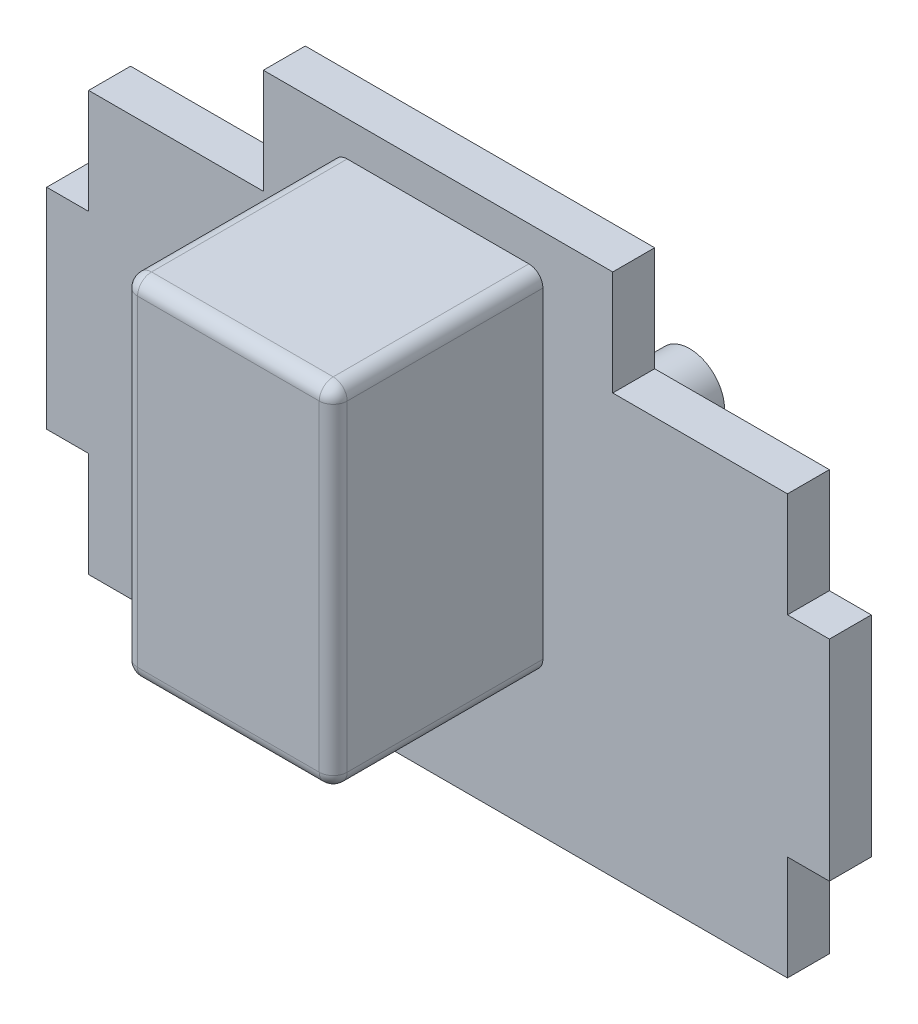
ISO-10303-21;
HEADER;
FILE_DESCRIPTION(('STEP AP214'),'2;1');
FILE_NAME('part.step','',(''),(''),'','','');
FILE_SCHEMA(('AUTOMOTIVE_DESIGN { 1 0 10303 214 1 1 1 1 }'));
ENDSEC;
DATA;
#1=APPLICATION_CONTEXT('core data for automotive mechanical design processes');
#2=APPLICATION_PROTOCOL_DEFINITION('international standard','automotive_design',2000,#1);
#3=PRODUCT_CONTEXT('',#1,'mechanical');
#4=PRODUCT('Part','Part','',(#3));
#5=PRODUCT_RELATED_PRODUCT_CATEGORY('part','',(#4));
#6=PRODUCT_DEFINITION_FORMATION('','',#4);
#7=PRODUCT_DEFINITION_CONTEXT('part definition',#1,'design');
#8=PRODUCT_DEFINITION('design','',#6,#7);
#9=PRODUCT_DEFINITION_SHAPE('','',#8);
#10=(LENGTH_UNIT() NAMED_UNIT(*) SI_UNIT(.MILLI.,.METRE.));
#11=(NAMED_UNIT(*) PLANE_ANGLE_UNIT() SI_UNIT($,.RADIAN.));
#12=(NAMED_UNIT(*) SI_UNIT($,.STERADIAN.) SOLID_ANGLE_UNIT());
#13=UNCERTAINTY_MEASURE_WITH_UNIT(LENGTH_MEASURE(1.E-05),#10,'distance_accuracy_value','');
#14=(GEOMETRIC_REPRESENTATION_CONTEXT(3) GLOBAL_UNCERTAINTY_ASSIGNED_CONTEXT((#13)) GLOBAL_UNIT_ASSIGNED_CONTEXT((#10,
#11,#12)) REPRESENTATION_CONTEXT('',''));
#15=CARTESIAN_POINT('',(0.,0.,0.));
#16=DIRECTION('',(0.,0.,1.));
#17=DIRECTION('',(1.,0.,0.));
#18=AXIS2_PLACEMENT_3D('',#15,#16,#17);
#19=CARTESIAN_POINT('',(0.,0.,0.));
#20=DIRECTION('',(0.,0.,1.));
#21=DIRECTION('',(1.,0.,0.));
#22=AXIS2_PLACEMENT_3D('',#19,#20,#21);
#23=PLANE('',#22);
#24=DIRECTION('',(0.,-1.,0.));
#25=VECTOR('',#24,1.);
#26=CARTESIAN_POINT('',(-1.25,0.,0.));
#27=LINE('',#26,#25);
#28=CARTESIAN_POINT('',(-1.25,-0.5,0.));
#29=VERTEX_POINT('',#28);
#30=CARTESIAN_POINT('',(-1.25,-1.25,0.));
#31=VERTEX_POINT('',#30);
#32=EDGE_CURVE('E220',#29,#31,#27,.T.);
#33=ORIENTED_EDGE('',*,*,#32,.F.);
#34=DIRECTION('',(-1.,0.,0.));
#35=VECTOR('',#34,1.);
#36=CARTESIAN_POINT('',(1.25,-0.5,0.));
#37=LINE('',#36,#35);
#38=CARTESIAN_POINT('',(1.25,-0.5,0.));
#39=VERTEX_POINT('',#38);
#40=EDGE_CURVE('E49',#39,#29,#37,.T.);
#41=ORIENTED_EDGE('',*,*,#40,.F.);
#42=DIRECTION('',(0.,1.,0.));
#43=VECTOR('',#42,1.);
#44=CARTESIAN_POINT('',(1.25,0.,0.));
#45=LINE('',#44,#43);
#46=CARTESIAN_POINT('',(1.25,-1.25,0.));
#47=VERTEX_POINT('',#46);
#48=EDGE_CURVE('E218',#47,#39,#45,.T.);
#49=ORIENTED_EDGE('',*,*,#48,.F.);
#50=DIRECTION('',(-1.,0.,0.));
#51=VECTOR('',#50,1.);
#52=CARTESIAN_POINT('',(1.25,-1.25,0.));
#53=LINE('',#52,#51);
#54=CARTESIAN_POINT('',(2.5,-1.25,0.));
#55=VERTEX_POINT('',#54);
#56=EDGE_CURVE('E260',#55,#47,#53,.T.);
#57=ORIENTED_EDGE('',*,*,#56,.F.);
#58=DIRECTION('',(0.,1.,0.));
#59=VECTOR('',#58,1.);
#60=CARTESIAN_POINT('',(2.5,-1.25,0.));
#61=LINE('',#60,#59);
#62=CARTESIAN_POINT('',(2.5,-2.,0.));
#63=VERTEX_POINT('',#62);
#64=EDGE_CURVE('E258',#63,#55,#61,.T.);
#65=ORIENTED_EDGE('',*,*,#64,.F.);
#66=DIRECTION('',(-1.,0.,0.));
#67=VECTOR('',#66,1.);
#68=CARTESIAN_POINT('',(2.5,-2.,0.));
#69=LINE('',#68,#67);
#70=CARTESIAN_POINT('',(2.8,-2.,0.));
#71=VERTEX_POINT('',#70);
#72=EDGE_CURVE('E256',#71,#63,#69,.T.);
#73=ORIENTED_EDGE('',*,*,#72,.F.);
#74=DIRECTION('',(0.,1.,0.));
#75=VECTOR('',#74,1.);
#76=CARTESIAN_POINT('',(2.8,-2.,0.));
#77=LINE('',#76,#75);
#78=CARTESIAN_POINT('',(2.8,-3.5,0.));
#79=VERTEX_POINT('',#78);
#80=EDGE_CURVE('E254',#79,#71,#77,.T.);
#81=ORIENTED_EDGE('',*,*,#80,.F.);
#82=DIRECTION('',(1.,0.,0.));
#83=VECTOR('',#82,1.);
#84=CARTESIAN_POINT('',(2.8,-3.5,0.));
#85=LINE('',#84,#83);
#86=CARTESIAN_POINT('',(2.5,-3.5,0.));
#87=VERTEX_POINT('',#86);
#88=EDGE_CURVE('E252',#87,#79,#85,.T.);
#89=ORIENTED_EDGE('',*,*,#88,.F.);
#90=DIRECTION('',(0.,1.,0.));
#91=VECTOR('',#90,1.);
#92=CARTESIAN_POINT('',(2.5,-3.5,0.));
#93=LINE('',#92,#91);
#94=CARTESIAN_POINT('',(2.5,-4.25,0.));
#95=VERTEX_POINT('',#94);
#96=EDGE_CURVE('E250',#95,#87,#93,.T.);
#97=ORIENTED_EDGE('',*,*,#96,.F.);
#98=DIRECTION('',(1.,0.,0.));
#99=VECTOR('',#98,1.);
#100=CARTESIAN_POINT('',(2.5,-4.25,0.));
#101=LINE('',#100,#99);
#102=CARTESIAN_POINT('',(-2.5,-4.25,0.));
#103=VERTEX_POINT('',#102);
#104=EDGE_CURVE('E248',#103,#95,#101,.T.);
#105=ORIENTED_EDGE('',*,*,#104,.F.);
#106=DIRECTION('',(0.,-1.,0.));
#107=VECTOR('',#106,1.);
#108=CARTESIAN_POINT('',(-2.5,-3.5,0.));
#109=LINE('',#108,#107);
#110=CARTESIAN_POINT('',(-2.5,-3.5,0.));
#111=VERTEX_POINT('',#110);
#112=EDGE_CURVE('E246',#111,#103,#109,.T.);
#113=ORIENTED_EDGE('',*,*,#112,.F.);
#114=DIRECTION('',(1.,0.,0.));
#115=VECTOR('',#114,1.);
#116=CARTESIAN_POINT('',(-2.8,-3.5,0.));
#117=LINE('',#116,#115);
#118=CARTESIAN_POINT('',(-2.8,-3.5,0.));
#119=VERTEX_POINT('',#118);
#120=EDGE_CURVE('E244',#119,#111,#117,.T.);
#121=ORIENTED_EDGE('',*,*,#120,.F.);
#122=DIRECTION('',(0.,-1.,0.));
#123=VECTOR('',#122,1.);
#124=CARTESIAN_POINT('',(-2.8,-2.,0.));
#125=LINE('',#124,#123);
#126=CARTESIAN_POINT('',(-2.8,-2.,0.));
#127=VERTEX_POINT('',#126);
#128=EDGE_CURVE('E242',#127,#119,#125,.T.);
#129=ORIENTED_EDGE('',*,*,#128,.F.);
#130=DIRECTION('',(-1.,0.,0.));
#131=VECTOR('',#130,1.);
#132=CARTESIAN_POINT('',(-2.5,-2.,0.));
#133=LINE('',#132,#131);
#134=CARTESIAN_POINT('',(-2.5,-2.,0.));
#135=VERTEX_POINT('',#134);
#136=EDGE_CURVE('E240',#135,#127,#133,.T.);
#137=ORIENTED_EDGE('',*,*,#136,.F.);
#138=DIRECTION('',(0.,-1.,0.));
#139=VECTOR('',#138,1.);
#140=CARTESIAN_POINT('',(-2.5,-1.25,0.));
#141=LINE('',#140,#139);
#142=CARTESIAN_POINT('',(-2.5,-1.25,0.));
#143=VERTEX_POINT('',#142);
#144=EDGE_CURVE('E238',#143,#135,#141,.T.);
#145=ORIENTED_EDGE('',*,*,#144,.F.);
#146=DIRECTION('',(-1.,0.,0.));
#147=VECTOR('',#146,1.);
#148=CARTESIAN_POINT('',(-1.25,-1.25,0.));
#149=LINE('',#148,#147);
#150=EDGE_CURVE('E228',#31,#143,#149,.T.);
#151=ORIENTED_EDGE('',*,*,#150,.F.);
#152=EDGE_LOOP('',(#33,#41,#49,#57,#65,#73,#81,#89,#97,#105,#113,#121,#129,#137,#145,#151));
#153=FACE_BOUND('',#152,.T.);
#154=CARTESIAN_POINT('',(0.,-2.75,0.));
#155=DIRECTION('',(0.,0.,1.));
#156=DIRECTION('',(1.,0.,0.));
#157=AXIS2_PLACEMENT_3D('',#154,#155,#156);
#158=CIRCLE('',#157,0.25);
#159=CARTESIAN_POINT('',(0.25,-2.75,0.));
#160=VERTEX_POINT('',#159);
#161=EDGE_CURVE('E42',#160,#160,#158,.F.);
#162=ORIENTED_EDGE('',*,*,#161,.F.);
#163=EDGE_LOOP('',(#162));
#164=FACE_BOUND('',#163,.T.);
#165=ADVANCED_FACE('F34',(#153,#164),#23,.F.);
#166=CARTESIAN_POINT('',(0.,0.,0.3));
#167=DIRECTION('',(0.,0.,1.));
#168=DIRECTION('',(1.,0.,0.));
#169=AXIS2_PLACEMENT_3D('',#166,#167,#168);
#170=PLANE('',#169);
#171=DIRECTION('',(1.,0.,0.));
#172=VECTOR('',#171,1.);
#173=CARTESIAN_POINT('',(0.,-0.5,0.3));
#174=LINE('',#173,#172);
#175=CARTESIAN_POINT('',(-1.25,-0.5,0.3));
#176=VERTEX_POINT('',#175);
#177=CARTESIAN_POINT('',(1.25,-0.5,0.3));
#178=VERTEX_POINT('',#177);
#179=EDGE_CURVE('E207',#176,#178,#174,.T.);
#180=ORIENTED_EDGE('',*,*,#179,.F.);
#181=DIRECTION('',(0.,-1.,0.));
#182=VECTOR('',#181,1.);
#183=CARTESIAN_POINT('',(-1.25,0.,0.3));
#184=LINE('',#183,#182);
#185=CARTESIAN_POINT('',(-1.25,-1.25,0.3));
#186=VERTEX_POINT('',#185);
#187=EDGE_CURVE('E541',#176,#186,#184,.T.);
#188=ORIENTED_EDGE('',*,*,#187,.T.);
#189=DIRECTION('',(-1.,0.,0.));
#190=VECTOR('',#189,1.);
#191=CARTESIAN_POINT('',(-1.25,-1.25,0.3));
#192=LINE('',#191,#190);
#193=CARTESIAN_POINT('',(-2.5,-1.25,0.3));
#194=VERTEX_POINT('',#193);
#195=EDGE_CURVE('E543',#186,#194,#192,.T.);
#196=ORIENTED_EDGE('',*,*,#195,.T.);
#197=DIRECTION('',(0.,-1.,0.));
#198=VECTOR('',#197,1.);
#199=CARTESIAN_POINT('',(-2.5,-1.25,0.3));
#200=LINE('',#199,#198);
#201=CARTESIAN_POINT('',(-2.5,-2.,0.3));
#202=VERTEX_POINT('',#201);
#203=EDGE_CURVE('E545',#194,#202,#200,.T.);
#204=ORIENTED_EDGE('',*,*,#203,.T.);
#205=DIRECTION('',(-1.,0.,0.));
#206=VECTOR('',#205,1.);
#207=CARTESIAN_POINT('',(-2.5,-2.,0.3));
#208=LINE('',#207,#206);
#209=CARTESIAN_POINT('',(-2.8,-2.,0.3));
#210=VERTEX_POINT('',#209);
#211=EDGE_CURVE('E547',#202,#210,#208,.T.);
#212=ORIENTED_EDGE('',*,*,#211,.T.);
#213=DIRECTION('',(0.,-1.,0.));
#214=VECTOR('',#213,1.);
#215=CARTESIAN_POINT('',(-2.8,-2.,0.3));
#216=LINE('',#215,#214);
#217=CARTESIAN_POINT('',(-2.8,-3.5,0.3));
#218=VERTEX_POINT('',#217);
#219=EDGE_CURVE('E549',#210,#218,#216,.T.);
#220=ORIENTED_EDGE('',*,*,#219,.T.);
#221=DIRECTION('',(1.,0.,0.));
#222=VECTOR('',#221,1.);
#223=CARTESIAN_POINT('',(-2.8,-3.5,0.3));
#224=LINE('',#223,#222);
#225=CARTESIAN_POINT('',(-2.5,-3.5,0.3));
#226=VERTEX_POINT('',#225);
#227=EDGE_CURVE('E551',#218,#226,#224,.T.);
#228=ORIENTED_EDGE('',*,*,#227,.T.);
#229=DIRECTION('',(0.,-1.,0.));
#230=VECTOR('',#229,1.);
#231=CARTESIAN_POINT('',(-2.5,-3.5,0.3));
#232=LINE('',#231,#230);
#233=CARTESIAN_POINT('',(-2.5,-4.25,0.3));
#234=VERTEX_POINT('',#233);
#235=EDGE_CURVE('E553',#226,#234,#232,.T.);
#236=ORIENTED_EDGE('',*,*,#235,.T.);
#237=DIRECTION('',(1.,0.,0.));
#238=VECTOR('',#237,1.);
#239=CARTESIAN_POINT('',(2.5,-4.25,0.3));
#240=LINE('',#239,#238);
#241=CARTESIAN_POINT('',(2.5,-4.25,0.3));
#242=VERTEX_POINT('',#241);
#243=EDGE_CURVE('E555',#234,#242,#240,.T.);
#244=ORIENTED_EDGE('',*,*,#243,.T.);
#245=DIRECTION('',(0.,1.,0.));
#246=VECTOR('',#245,1.);
#247=CARTESIAN_POINT('',(2.5,-3.5,0.3));
#248=LINE('',#247,#246);
#249=CARTESIAN_POINT('',(2.5,-3.5,0.3));
#250=VERTEX_POINT('',#249);
#251=EDGE_CURVE('E557',#242,#250,#248,.T.);
#252=ORIENTED_EDGE('',*,*,#251,.T.);
#253=DIRECTION('',(1.,0.,0.));
#254=VECTOR('',#253,1.);
#255=CARTESIAN_POINT('',(2.8,-3.5,0.3));
#256=LINE('',#255,#254);
#257=CARTESIAN_POINT('',(2.8,-3.5,0.3));
#258=VERTEX_POINT('',#257);
#259=EDGE_CURVE('E559',#250,#258,#256,.T.);
#260=ORIENTED_EDGE('',*,*,#259,.T.);
#261=DIRECTION('',(0.,1.,0.));
#262=VECTOR('',#261,1.);
#263=CARTESIAN_POINT('',(2.8,-2.,0.3));
#264=LINE('',#263,#262);
#265=CARTESIAN_POINT('',(2.8,-2.,0.3));
#266=VERTEX_POINT('',#265);
#267=EDGE_CURVE('E561',#258,#266,#264,.T.);
#268=ORIENTED_EDGE('',*,*,#267,.T.);
#269=DIRECTION('',(-1.,0.,0.));
#270=VECTOR('',#269,1.);
#271=CARTESIAN_POINT('',(2.5,-2.,0.3));
#272=LINE('',#271,#270);
#273=CARTESIAN_POINT('',(2.5,-2.,0.3));
#274=VERTEX_POINT('',#273);
#275=EDGE_CURVE('E563',#266,#274,#272,.T.);
#276=ORIENTED_EDGE('',*,*,#275,.T.);
#277=DIRECTION('',(0.,1.,0.));
#278=VECTOR('',#277,1.);
#279=CARTESIAN_POINT('',(2.5,-1.25,0.3));
#280=LINE('',#279,#278);
#281=CARTESIAN_POINT('',(2.5,-1.25,0.3));
#282=VERTEX_POINT('',#281);
#283=EDGE_CURVE('E564',#274,#282,#280,.T.);
#284=ORIENTED_EDGE('',*,*,#283,.T.);
#285=DIRECTION('',(-1.,0.,0.));
#286=VECTOR('',#285,1.);
#287=CARTESIAN_POINT('',(1.25,-1.25,0.3));
#288=LINE('',#287,#286);
#289=CARTESIAN_POINT('',(1.25,-1.25,0.3));
#290=VERTEX_POINT('',#289);
#291=EDGE_CURVE('E234',#282,#290,#288,.T.);
#292=ORIENTED_EDGE('',*,*,#291,.T.);
#293=DIRECTION('',(0.,1.,0.));
#294=VECTOR('',#293,1.);
#295=CARTESIAN_POINT('',(1.25,0.,0.3));
#296=LINE('',#295,#294);
#297=EDGE_CURVE('E262',#290,#178,#296,.T.);
#298=ORIENTED_EDGE('',*,*,#297,.T.);
#299=EDGE_LOOP('',(#180,#188,#196,#204,#212,#220,#228,#236,#244,#252,#260,#268,#276,#284,#292,#298));
#300=FACE_BOUND('',#299,.T.);
#301=DIRECTION('',(0.,1.,0.));
#302=VECTOR('',#301,1.);
#303=CARTESIAN_POINT('',(0.75,0.,0.3));
#304=LINE('',#303,#302);
#305=CARTESIAN_POINT('',(0.75,-3.15,0.3));
#306=VERTEX_POINT('',#305);
#307=CARTESIAN_POINT('',(0.75,-0.85,0.3));
#308=VERTEX_POINT('',#307);
#309=EDGE_CURVE('E534',#306,#308,#304,.T.);
#310=ORIENTED_EDGE('',*,*,#309,.F.);
#311=CARTESIAN_POINT('',(0.65,-3.15,0.3));
#312=DIRECTION('',(0.,0.,1.));
#313=DIRECTION('',(1.,0.,0.));
#314=AXIS2_PLACEMENT_3D('',#311,#312,#313);
#315=CIRCLE('',#314,0.1);
#316=CARTESIAN_POINT('',(0.65,-3.25,0.3));
#317=VERTEX_POINT('',#316);
#318=EDGE_CURVE('E340',#306,#317,#315,.F.);
#319=ORIENTED_EDGE('',*,*,#318,.T.);
#320=DIRECTION('',(1.,0.,0.));
#321=VECTOR('',#320,1.);
#322=CARTESIAN_POINT('',(0.,-3.25,0.3));
#323=LINE('',#322,#321);
#324=CARTESIAN_POINT('',(-0.65,-3.25,0.3));
#325=VERTEX_POINT('',#324);
#326=EDGE_CURVE('E379',#325,#317,#323,.T.);
#327=ORIENTED_EDGE('',*,*,#326,.F.);
#328=CARTESIAN_POINT('',(-0.65,-3.15,0.3));
#329=DIRECTION('',(0.,0.,1.));
#330=DIRECTION('',(1.,0.,0.));
#331=AXIS2_PLACEMENT_3D('',#328,#329,#330);
#332=CIRCLE('',#331,0.1);
#333=CARTESIAN_POINT('',(-0.75,-3.15,0.3));
#334=VERTEX_POINT('',#333);
#335=EDGE_CURVE('E338',#325,#334,#332,.F.);
#336=ORIENTED_EDGE('',*,*,#335,.T.);
#337=DIRECTION('',(0.,-1.,0.));
#338=VECTOR('',#337,1.);
#339=CARTESIAN_POINT('',(-0.75,0.,0.3));
#340=LINE('',#339,#338);
#341=CARTESIAN_POINT('',(-0.75,-0.85,0.3));
#342=VERTEX_POINT('',#341);
#343=EDGE_CURVE('E226',#342,#334,#340,.T.);
#344=ORIENTED_EDGE('',*,*,#343,.F.);
#345=CARTESIAN_POINT('',(-0.65,-0.85,0.3));
#346=DIRECTION('',(0.,0.,1.));
#347=DIRECTION('',(1.,0.,0.));
#348=AXIS2_PLACEMENT_3D('',#345,#346,#347);
#349=CIRCLE('',#348,0.1);
#350=CARTESIAN_POINT('',(-0.65,-0.75,0.3));
#351=VERTEX_POINT('',#350);
#352=EDGE_CURVE('E336',#342,#351,#349,.F.);
#353=ORIENTED_EDGE('',*,*,#352,.T.);
#354=DIRECTION('',(1.,0.,0.));
#355=VECTOR('',#354,1.);
#356=CARTESIAN_POINT('',(0.,-0.75,0.3));
#357=LINE('',#356,#355);
#358=CARTESIAN_POINT('',(0.65,-0.75,0.3));
#359=VERTEX_POINT('',#358);
#360=EDGE_CURVE('E231',#351,#359,#357,.T.);
#361=ORIENTED_EDGE('',*,*,#360,.T.);
#362=CARTESIAN_POINT('',(0.65,-0.85,0.3));
#363=DIRECTION('',(0.,0.,1.));
#364=DIRECTION('',(1.,0.,0.));
#365=AXIS2_PLACEMENT_3D('',#362,#363,#364);
#366=CIRCLE('',#365,0.1);
#367=EDGE_CURVE('E342',#359,#308,#366,.F.);
#368=ORIENTED_EDGE('',*,*,#367,.T.);
#369=EDGE_LOOP('',(#310,#319,#327,#336,#344,#353,#361,#368));
#370=FACE_BOUND('',#369,.T.);
#371=ADVANCED_FACE('F385',(#300,#370),#170,.T.);
#372=CARTESIAN_POINT('',(1.25,0.,0.3));
#373=DIRECTION('',(-1.,0.,0.));
#374=DIRECTION('',(0.,0.,1.));
#375=AXIS2_PLACEMENT_3D('',#372,#373,#374);
#376=PLANE('',#375);
#377=ORIENTED_EDGE('',*,*,#48,.T.);
#378=DIRECTION('',(0.,0.,-1.));
#379=VECTOR('',#378,1.);
#380=CARTESIAN_POINT('',(1.25,-0.5,10.));
#381=LINE('',#380,#379);
#382=EDGE_CURVE('E204',#178,#39,#381,.T.);
#383=ORIENTED_EDGE('',*,*,#382,.F.);
#384=ORIENTED_EDGE('',*,*,#297,.F.);
#385=DIRECTION('',(0.,0.,-1.));
#386=VECTOR('',#385,1.);
#387=CARTESIAN_POINT('',(1.25,-1.25,0.3));
#388=LINE('',#387,#386);
#389=EDGE_CURVE('E225',#290,#47,#388,.T.);
#390=ORIENTED_EDGE('',*,*,#389,.T.);
#391=EDGE_LOOP('',(#377,#383,#384,#390));
#392=FACE_BOUND('',#391,.T.);
#393=ADVANCED_FACE('F223',(#392),#376,.F.);
#394=CARTESIAN_POINT('',(-1.25,0.,0.3));
#395=DIRECTION('',(1.,0.,0.));
#396=DIRECTION('',(0.,0.,-1.));
#397=AXIS2_PLACEMENT_3D('',#394,#395,#396);
#398=PLANE('',#397);
#399=ORIENTED_EDGE('',*,*,#187,.F.);
#400=DIRECTION('',(0.,0.,-1.));
#401=VECTOR('',#400,1.);
#402=CARTESIAN_POINT('',(-1.25,-0.5,0.3));
#403=LINE('',#402,#401);
#404=EDGE_CURVE('E11',#176,#29,#403,.T.);
#405=ORIENTED_EDGE('',*,*,#404,.T.);
#406=ORIENTED_EDGE('',*,*,#32,.T.);
#407=DIRECTION('',(0.,0.,-1.));
#408=VECTOR('',#407,1.);
#409=CARTESIAN_POINT('',(-1.25,-1.25,0.3));
#410=LINE('',#409,#408);
#411=EDGE_CURVE('E300',#186,#31,#410,.T.);
#412=ORIENTED_EDGE('',*,*,#411,.F.);
#413=EDGE_LOOP('',(#399,#405,#406,#412));
#414=FACE_BOUND('',#413,.T.);
#415=ADVANCED_FACE('F447',(#414),#398,.F.);
#416=CARTESIAN_POINT('',(-1.25,-1.25,0.3));
#417=DIRECTION('',(0.,-1.,0.));
#418=DIRECTION('',(0.,0.,-1.));
#419=AXIS2_PLACEMENT_3D('',#416,#417,#418);
#420=PLANE('',#419);
#421=ORIENTED_EDGE('',*,*,#150,.T.);
#422=DIRECTION('',(0.,0.,-1.));
#423=VECTOR('',#422,1.);
#424=CARTESIAN_POINT('',(-2.5,-1.25,0.3));
#425=LINE('',#424,#423);
#426=EDGE_CURVE('E297',#194,#143,#425,.T.);
#427=ORIENTED_EDGE('',*,*,#426,.F.);
#428=ORIENTED_EDGE('',*,*,#195,.F.);
#429=ORIENTED_EDGE('',*,*,#411,.T.);
#430=EDGE_LOOP('',(#421,#427,#428,#429));
#431=FACE_BOUND('',#430,.T.);
#432=ADVANCED_FACE('F443',(#431),#420,.F.);
#433=CARTESIAN_POINT('',(-2.5,-1.25,0.3));
#434=DIRECTION('',(1.,0.,0.));
#435=DIRECTION('',(0.,0.,-1.));
#436=AXIS2_PLACEMENT_3D('',#433,#434,#435);
#437=PLANE('',#436);
#438=ORIENTED_EDGE('',*,*,#144,.T.);
#439=DIRECTION('',(0.,0.,-1.));
#440=VECTOR('',#439,1.);
#441=CARTESIAN_POINT('',(-2.5,-2.,0.3));
#442=LINE('',#441,#440);
#443=EDGE_CURVE('E294',#202,#135,#442,.T.);
#444=ORIENTED_EDGE('',*,*,#443,.F.);
#445=ORIENTED_EDGE('',*,*,#203,.F.);
#446=ORIENTED_EDGE('',*,*,#426,.T.);
#447=EDGE_LOOP('',(#438,#444,#445,#446));
#448=FACE_BOUND('',#447,.T.);
#449=ADVANCED_FACE('F439',(#448),#437,.F.);
#450=CARTESIAN_POINT('',(-2.5,-2.,0.3));
#451=DIRECTION('',(0.,-1.,0.));
#452=DIRECTION('',(0.,0.,-1.));
#453=AXIS2_PLACEMENT_3D('',#450,#451,#452);
#454=PLANE('',#453);
#455=ORIENTED_EDGE('',*,*,#136,.T.);
#456=DIRECTION('',(0.,0.,-1.));
#457=VECTOR('',#456,1.);
#458=CARTESIAN_POINT('',(-2.8,-2.,0.3));
#459=LINE('',#458,#457);
#460=EDGE_CURVE('E291',#210,#127,#459,.T.);
#461=ORIENTED_EDGE('',*,*,#460,.F.);
#462=ORIENTED_EDGE('',*,*,#211,.F.);
#463=ORIENTED_EDGE('',*,*,#443,.T.);
#464=EDGE_LOOP('',(#455,#461,#462,#463));
#465=FACE_BOUND('',#464,.T.);
#466=ADVANCED_FACE('F435',(#465),#454,.F.);
#467=CARTESIAN_POINT('',(-2.8,-2.,0.3));
#468=DIRECTION('',(1.,0.,0.));
#469=DIRECTION('',(0.,1.,0.));
#470=AXIS2_PLACEMENT_3D('',#467,#468,#469);
#471=PLANE('',#470);
#472=ORIENTED_EDGE('',*,*,#128,.T.);
#473=DIRECTION('',(0.,0.,-1.));
#474=VECTOR('',#473,1.);
#475=CARTESIAN_POINT('',(-2.8,-3.5,0.3));
#476=LINE('',#475,#474);
#477=EDGE_CURVE('E288',#218,#119,#476,.T.);
#478=ORIENTED_EDGE('',*,*,#477,.F.);
#479=ORIENTED_EDGE('',*,*,#219,.F.);
#480=ORIENTED_EDGE('',*,*,#460,.T.);
#481=EDGE_LOOP('',(#472,#478,#479,#480));
#482=FACE_BOUND('',#481,.T.);
#483=ADVANCED_FACE('F431',(#482),#471,.F.);
#484=CARTESIAN_POINT('',(-2.8,-3.5,0.3));
#485=DIRECTION('',(0.,1.,0.));
#486=DIRECTION('',(0.,0.,1.));
#487=AXIS2_PLACEMENT_3D('',#484,#485,#486);
#488=PLANE('',#487);
#489=ORIENTED_EDGE('',*,*,#120,.T.);
#490=DIRECTION('',(0.,0.,-1.));
#491=VECTOR('',#490,1.);
#492=CARTESIAN_POINT('',(-2.5,-3.5,0.3));
#493=LINE('',#492,#491);
#494=EDGE_CURVE('E285',#226,#111,#493,.T.);
#495=ORIENTED_EDGE('',*,*,#494,.F.);
#496=ORIENTED_EDGE('',*,*,#227,.F.);
#497=ORIENTED_EDGE('',*,*,#477,.T.);
#498=EDGE_LOOP('',(#489,#495,#496,#497));
#499=FACE_BOUND('',#498,.T.);
#500=ADVANCED_FACE('F427',(#499),#488,.F.);
#501=CARTESIAN_POINT('',(-2.5,-3.5,0.3));
#502=DIRECTION('',(1.,0.,0.));
#503=DIRECTION('',(0.,1.,0.));
#504=AXIS2_PLACEMENT_3D('',#501,#502,#503);
#505=PLANE('',#504);
#506=ORIENTED_EDGE('',*,*,#112,.T.);
#507=DIRECTION('',(0.,0.,-1.));
#508=VECTOR('',#507,1.);
#509=CARTESIAN_POINT('',(-2.5,-4.25,0.3));
#510=LINE('',#509,#508);
#511=EDGE_CURVE('E282',#234,#103,#510,.T.);
#512=ORIENTED_EDGE('',*,*,#511,.F.);
#513=ORIENTED_EDGE('',*,*,#235,.F.);
#514=ORIENTED_EDGE('',*,*,#494,.T.);
#515=EDGE_LOOP('',(#506,#512,#513,#514));
#516=FACE_BOUND('',#515,.T.);
#517=ADVANCED_FACE('F423',(#516),#505,.F.);
#518=CARTESIAN_POINT('',(2.5,-4.25,0.3));
#519=DIRECTION('',(0.,1.,0.));
#520=DIRECTION('',(0.,0.,1.));
#521=AXIS2_PLACEMENT_3D('',#518,#519,#520);
#522=PLANE('',#521);
#523=ORIENTED_EDGE('',*,*,#104,.T.);
#524=DIRECTION('',(0.,0.,-1.));
#525=VECTOR('',#524,1.);
#526=CARTESIAN_POINT('',(2.5,-4.25,0.3));
#527=LINE('',#526,#525);
#528=EDGE_CURVE('E279',#242,#95,#527,.T.);
#529=ORIENTED_EDGE('',*,*,#528,.F.);
#530=ORIENTED_EDGE('',*,*,#243,.F.);
#531=ORIENTED_EDGE('',*,*,#511,.T.);
#532=EDGE_LOOP('',(#523,#529,#530,#531));
#533=FACE_BOUND('',#532,.T.);
#534=ADVANCED_FACE('F419',(#533),#522,.F.);
#535=CARTESIAN_POINT('',(2.5,-3.5,0.3));
#536=DIRECTION('',(-1.,0.,0.));
#537=DIRECTION('',(0.,-1.,0.));
#538=AXIS2_PLACEMENT_3D('',#535,#536,#537);
#539=PLANE('',#538);
#540=ORIENTED_EDGE('',*,*,#96,.T.);
#541=DIRECTION('',(0.,0.,-1.));
#542=VECTOR('',#541,1.);
#543=CARTESIAN_POINT('',(2.5,-3.5,0.3));
#544=LINE('',#543,#542);
#545=EDGE_CURVE('E276',#250,#87,#544,.T.);
#546=ORIENTED_EDGE('',*,*,#545,.F.);
#547=ORIENTED_EDGE('',*,*,#251,.F.);
#548=ORIENTED_EDGE('',*,*,#528,.T.);
#549=EDGE_LOOP('',(#540,#546,#547,#548));
#550=FACE_BOUND('',#549,.T.);
#551=ADVANCED_FACE('F415',(#550),#539,.F.);
#552=CARTESIAN_POINT('',(2.8,-3.5,0.3));
#553=DIRECTION('',(0.,1.,0.));
#554=DIRECTION('',(0.,0.,1.));
#555=AXIS2_PLACEMENT_3D('',#552,#553,#554);
#556=PLANE('',#555);
#557=ORIENTED_EDGE('',*,*,#88,.T.);
#558=DIRECTION('',(0.,0.,-1.));
#559=VECTOR('',#558,1.);
#560=CARTESIAN_POINT('',(2.8,-3.5,0.3));
#561=LINE('',#560,#559);
#562=EDGE_CURVE('E273',#258,#79,#561,.T.);
#563=ORIENTED_EDGE('',*,*,#562,.F.);
#564=ORIENTED_EDGE('',*,*,#259,.F.);
#565=ORIENTED_EDGE('',*,*,#545,.T.);
#566=EDGE_LOOP('',(#557,#563,#564,#565));
#567=FACE_BOUND('',#566,.T.);
#568=ADVANCED_FACE('F411',(#567),#556,.F.);
#569=CARTESIAN_POINT('',(2.8,-2.,0.3));
#570=DIRECTION('',(-1.,0.,0.));
#571=DIRECTION('',(0.,-1.,0.));
#572=AXIS2_PLACEMENT_3D('',#569,#570,#571);
#573=PLANE('',#572);
#574=ORIENTED_EDGE('',*,*,#80,.T.);
#575=DIRECTION('',(0.,0.,-1.));
#576=VECTOR('',#575,1.);
#577=CARTESIAN_POINT('',(2.8,-2.,0.3));
#578=LINE('',#577,#576);
#579=EDGE_CURVE('E270',#266,#71,#578,.T.);
#580=ORIENTED_EDGE('',*,*,#579,.F.);
#581=ORIENTED_EDGE('',*,*,#267,.F.);
#582=ORIENTED_EDGE('',*,*,#562,.T.);
#583=EDGE_LOOP('',(#574,#580,#581,#582));
#584=FACE_BOUND('',#583,.T.);
#585=ADVANCED_FACE('F407',(#584),#573,.F.);
#586=CARTESIAN_POINT('',(2.5,-2.,0.3));
#587=DIRECTION('',(0.,-1.,0.));
#588=DIRECTION('',(0.,0.,-1.));
#589=AXIS2_PLACEMENT_3D('',#586,#587,#588);
#590=PLANE('',#589);
#591=ORIENTED_EDGE('',*,*,#72,.T.);
#592=DIRECTION('',(0.,0.,-1.));
#593=VECTOR('',#592,1.);
#594=CARTESIAN_POINT('',(2.5,-2.,0.3));
#595=LINE('',#594,#593);
#596=EDGE_CURVE('E267',#274,#63,#595,.T.);
#597=ORIENTED_EDGE('',*,*,#596,.F.);
#598=ORIENTED_EDGE('',*,*,#275,.F.);
#599=ORIENTED_EDGE('',*,*,#579,.T.);
#600=EDGE_LOOP('',(#591,#597,#598,#599));
#601=FACE_BOUND('',#600,.T.);
#602=ADVANCED_FACE('F403',(#601),#590,.F.);
#603=CARTESIAN_POINT('',(2.5,-1.25,0.3));
#604=DIRECTION('',(-1.,0.,0.));
#605=DIRECTION('',(0.,0.,1.));
#606=AXIS2_PLACEMENT_3D('',#603,#604,#605);
#607=PLANE('',#606);
#608=ORIENTED_EDGE('',*,*,#64,.T.);
#609=DIRECTION('',(0.,0.,-1.));
#610=VECTOR('',#609,1.);
#611=CARTESIAN_POINT('',(2.5,-1.25,0.3));
#612=LINE('',#611,#610);
#613=EDGE_CURVE('E264',#282,#55,#612,.T.);
#614=ORIENTED_EDGE('',*,*,#613,.F.);
#615=ORIENTED_EDGE('',*,*,#283,.F.);
#616=ORIENTED_EDGE('',*,*,#596,.T.);
#617=EDGE_LOOP('',(#608,#614,#615,#616));
#618=FACE_BOUND('',#617,.T.);
#619=ADVANCED_FACE('F399',(#618),#607,.F.);
#620=CARTESIAN_POINT('',(1.25,-1.25,0.3));
#621=DIRECTION('',(0.,-1.,0.));
#622=DIRECTION('',(0.,0.,-1.));
#623=AXIS2_PLACEMENT_3D('',#620,#621,#622);
#624=PLANE('',#623);
#625=ORIENTED_EDGE('',*,*,#56,.T.);
#626=ORIENTED_EDGE('',*,*,#389,.F.);
#627=ORIENTED_EDGE('',*,*,#291,.F.);
#628=ORIENTED_EDGE('',*,*,#613,.T.);
#629=EDGE_LOOP('',(#625,#626,#627,#628));
#630=FACE_BOUND('',#629,.T.);
#631=ADVANCED_FACE('F395',(#630),#624,.F.);
#632=CARTESIAN_POINT('',(0.,-3.25,1.8));
#633=DIRECTION('',(0.,1.,0.));
#634=DIRECTION('',(0.,0.,1.));
#635=AXIS2_PLACEMENT_3D('',#632,#633,#634);
#636=PLANE('',#635);
#637=DIRECTION('',(1.,0.,0.));
#638=VECTOR('',#637,1.);
#639=CARTESIAN_POINT('',(-0.75,-3.25,1.7));
#640=LINE('',#639,#638);
#641=CARTESIAN_POINT('',(0.65,-3.25,1.7));
#642=VERTEX_POINT('',#641);
#643=CARTESIAN_POINT('',(-0.65,-3.25,1.7));
#644=VERTEX_POINT('',#643);
#645=EDGE_CURVE('E327',#642,#644,#640,.F.);
#646=ORIENTED_EDGE('',*,*,#645,.T.);
#647=DIRECTION('',(0.,0.,-1.));
#648=VECTOR('',#647,1.);
#649=CARTESIAN_POINT('',(-0.65,-3.25,1.8));
#650=LINE('',#649,#648);
#651=EDGE_CURVE('E329',#644,#325,#650,.T.);
#652=ORIENTED_EDGE('',*,*,#651,.T.);
#653=ORIENTED_EDGE('',*,*,#326,.T.);
#654=DIRECTION('',(0.,0.,-1.));
#655=VECTOR('',#654,1.);
#656=CARTESIAN_POINT('',(0.65,-3.25,1.8));
#657=LINE('',#656,#655);
#658=EDGE_CURVE('E325',#317,#642,#657,.F.);
#659=ORIENTED_EDGE('',*,*,#658,.T.);
#660=EDGE_LOOP('',(#646,#652,#653,#659));
#661=FACE_BOUND('',#660,.T.);
#662=ADVANCED_FACE('F398',(#661),#636,.F.);
#663=CARTESIAN_POINT('',(0.75,0.,1.8));
#664=DIRECTION('',(-1.,0.,0.));
#665=DIRECTION('',(0.,-1.,0.));
#666=AXIS2_PLACEMENT_3D('',#663,#664,#665);
#667=PLANE('',#666);
#668=DIRECTION('',(0.,1.,0.));
#669=VECTOR('',#668,1.);
#670=CARTESIAN_POINT('',(0.75,-3.25,1.7));
#671=LINE('',#670,#669);
#672=CARTESIAN_POINT('',(0.75,-0.85,1.7));
#673=VERTEX_POINT('',#672);
#674=CARTESIAN_POINT('',(0.75,-3.15,1.7));
#675=VERTEX_POINT('',#674);
#676=EDGE_CURVE('E56',#673,#675,#671,.F.);
#677=ORIENTED_EDGE('',*,*,#676,.T.);
#678=DIRECTION('',(0.,0.,-1.));
#679=VECTOR('',#678,1.);
#680=CARTESIAN_POINT('',(0.75,-3.15,1.8));
#681=LINE('',#680,#679);
#682=EDGE_CURVE('E334',#675,#306,#681,.T.);
#683=ORIENTED_EDGE('',*,*,#682,.T.);
#684=ORIENTED_EDGE('',*,*,#309,.T.);
#685=DIRECTION('',(0.,0.,-1.));
#686=VECTOR('',#685,1.);
#687=CARTESIAN_POINT('',(0.75,-0.85,1.8));
#688=LINE('',#687,#686);
#689=EDGE_CURVE('E331',#308,#673,#688,.F.);
#690=ORIENTED_EDGE('',*,*,#689,.T.);
#691=EDGE_LOOP('',(#677,#683,#684,#690));
#692=FACE_BOUND('',#691,.T.);
#693=ADVANCED_FACE('F607',(#692),#667,.F.);
#694=CARTESIAN_POINT('',(0.,-0.75,1.8));
#695=DIRECTION('',(0.,1.,0.));
#696=DIRECTION('',(0.,0.,1.));
#697=AXIS2_PLACEMENT_3D('',#694,#695,#696);
#698=PLANE('',#697);
#699=ORIENTED_EDGE('',*,*,#360,.F.);
#700=DIRECTION('',(0.,0.,-1.));
#701=VECTOR('',#700,1.);
#702=CARTESIAN_POINT('',(-0.65,-0.75,1.8));
#703=LINE('',#702,#701);
#704=CARTESIAN_POINT('',(-0.65,-0.75,1.7));
#705=VERTEX_POINT('',#704);
#706=EDGE_CURVE('E314',#351,#705,#703,.F.);
#707=ORIENTED_EDGE('',*,*,#706,.T.);
#708=DIRECTION('',(1.,0.,0.));
#709=VECTOR('',#708,1.);
#710=CARTESIAN_POINT('',(0.,-0.75,1.7));
#711=LINE('',#710,#709);
#712=CARTESIAN_POINT('',(0.65,-0.75,1.7));
#713=VERTEX_POINT('',#712);
#714=EDGE_CURVE('E312',#705,#713,#711,.T.);
#715=ORIENTED_EDGE('',*,*,#714,.T.);
#716=DIRECTION('',(0.,0.,-1.));
#717=VECTOR('',#716,1.);
#718=CARTESIAN_POINT('',(0.65,-0.75,0.3));
#719=LINE('',#718,#717);
#720=EDGE_CURVE('E310',#713,#359,#719,.T.);
#721=ORIENTED_EDGE('',*,*,#720,.T.);
#722=EDGE_LOOP('',(#699,#707,#715,#721));
#723=FACE_BOUND('',#722,.T.);
#724=ADVANCED_FACE('F531',(#723),#698,.T.);
#725=CARTESIAN_POINT('',(-0.75,0.,1.8));
#726=DIRECTION('',(1.,0.,0.));
#727=DIRECTION('',(0.,1.,0.));
#728=AXIS2_PLACEMENT_3D('',#725,#726,#727);
#729=PLANE('',#728);
#730=DIRECTION('',(0.,-1.,0.));
#731=VECTOR('',#730,1.);
#732=CARTESIAN_POINT('',(-0.75,-0.75,1.7));
#733=LINE('',#732,#731);
#734=CARTESIAN_POINT('',(-0.75,-3.15,1.7));
#735=VERTEX_POINT('',#734);
#736=CARTESIAN_POINT('',(-0.75,-0.85,1.7));
#737=VERTEX_POINT('',#736);
#738=EDGE_CURVE('E305',#735,#737,#733,.F.);
#739=ORIENTED_EDGE('',*,*,#738,.T.);
#740=DIRECTION('',(0.,0.,-1.));
#741=VECTOR('',#740,1.);
#742=CARTESIAN_POINT('',(-0.75,-0.85,0.3));
#743=LINE('',#742,#741);
#744=EDGE_CURVE('E307',#737,#342,#743,.T.);
#745=ORIENTED_EDGE('',*,*,#744,.T.);
#746=ORIENTED_EDGE('',*,*,#343,.T.);
#747=DIRECTION('',(0.,0.,-1.));
#748=VECTOR('',#747,1.);
#749=CARTESIAN_POINT('',(-0.75,-3.15,1.8));
#750=LINE('',#749,#748);
#751=EDGE_CURVE('E303',#334,#735,#750,.F.);
#752=ORIENTED_EDGE('',*,*,#751,.T.);
#753=EDGE_LOOP('',(#739,#745,#746,#752));
#754=FACE_BOUND('',#753,.T.);
#755=ADVANCED_FACE('F521',(#754),#729,.F.);
#756=CARTESIAN_POINT('',(0.,0.,1.8));
#757=DIRECTION('',(0.,0.,1.));
#758=DIRECTION('',(1.,0.,0.));
#759=AXIS2_PLACEMENT_3D('',#756,#757,#758);
#760=PLANE('',#759);
#761=DIRECTION('',(1.,0.,0.));
#762=VECTOR('',#761,1.);
#763=CARTESIAN_POINT('',(0.,-0.85,1.8));
#764=LINE('',#763,#762);
#765=CARTESIAN_POINT('',(0.65,-0.85,1.8));
#766=VERTEX_POINT('',#765);
#767=CARTESIAN_POINT('',(-0.65,-0.85,1.8));
#768=VERTEX_POINT('',#767);
#769=EDGE_CURVE('E318',#766,#768,#764,.F.);
#770=ORIENTED_EDGE('',*,*,#769,.T.);
#771=DIRECTION('',(0.,-1.,0.));
#772=VECTOR('',#771,1.);
#773=CARTESIAN_POINT('',(-0.65,-3.25,1.8));
#774=LINE('',#773,#772);
#775=CARTESIAN_POINT('',(-0.65,-3.15,1.8));
#776=VERTEX_POINT('',#775);
#777=EDGE_CURVE('E322',#768,#776,#774,.T.);
#778=ORIENTED_EDGE('',*,*,#777,.T.);
#779=DIRECTION('',(1.,0.,0.));
#780=VECTOR('',#779,1.);
#781=CARTESIAN_POINT('',(0.75,-3.15,1.8));
#782=LINE('',#781,#780);
#783=CARTESIAN_POINT('',(0.65,-3.15,1.8));
#784=VERTEX_POINT('',#783);
#785=EDGE_CURVE('E320',#776,#784,#782,.T.);
#786=ORIENTED_EDGE('',*,*,#785,.T.);
#787=DIRECTION('',(0.,1.,0.));
#788=VECTOR('',#787,1.);
#789=CARTESIAN_POINT('',(0.65,-0.75,1.8));
#790=LINE('',#789,#788);
#791=EDGE_CURVE('E316',#784,#766,#790,.T.);
#792=ORIENTED_EDGE('',*,*,#791,.T.);
#793=EDGE_LOOP('',(#770,#778,#786,#792));
#794=FACE_BOUND('',#793,.T.);
#795=ADVANCED_FACE('F499',(#794),#760,.T.);
#796=CARTESIAN_POINT('',(0.65,-3.15,1.8));
#797=DIRECTION('',(0.,0.,-1.));
#798=DIRECTION('',(-1.,0.,0.));
#799=AXIS2_PLACEMENT_3D('',#796,#797,#798);
#800=CYLINDRICAL_SURFACE('',#799,0.1);
#801=CARTESIAN_POINT('',(0.65,-3.15,1.7));
#802=DIRECTION('',(0.,0.,1.));
#803=DIRECTION('',(1.,0.,0.));
#804=AXIS2_PLACEMENT_3D('',#801,#802,#803);
#805=CIRCLE('',#804,0.1);
#806=EDGE_CURVE('E377',#642,#675,#805,.T.);
#807=ORIENTED_EDGE('',*,*,#806,.F.);
#808=ORIENTED_EDGE('',*,*,#658,.F.);
#809=ORIENTED_EDGE('',*,*,#318,.F.);
#810=ORIENTED_EDGE('',*,*,#682,.F.);
#811=EDGE_LOOP('',(#807,#808,#809,#810));
#812=FACE_BOUND('',#811,.T.);
#813=ADVANCED_FACE('F36',(#812),#800,.T.);
#814=CARTESIAN_POINT('',(0.65,-3.15,1.7));
#815=DIRECTION('',(0.,0.,1.));
#816=DIRECTION('',(1.,0.,0.));
#817=AXIS2_PLACEMENT_3D('',#814,#815,#816);
#818=SPHERICAL_SURFACE('',#817,0.1);
#819=CARTESIAN_POINT('',(0.65,-3.15,1.7));
#820=DIRECTION('',(1.,0.,0.));
#821=DIRECTION('',(0.,0.,-1.));
#822=AXIS2_PLACEMENT_3D('',#819,#820,#821);
#823=CIRCLE('',#822,0.1);
#824=EDGE_CURVE('E371',#642,#784,#823,.F.);
#825=ORIENTED_EDGE('',*,*,#824,.F.);
#826=ORIENTED_EDGE('',*,*,#806,.T.);
#827=CARTESIAN_POINT('',(0.65,-3.15,1.7));
#828=DIRECTION('',(0.,-1.,0.));
#829=DIRECTION('',(0.,0.,-1.));
#830=AXIS2_PLACEMENT_3D('',#827,#828,#829);
#831=CIRCLE('',#830,0.1);
#832=EDGE_CURVE('E374',#784,#675,#831,.F.);
#833=ORIENTED_EDGE('',*,*,#832,.F.);
#834=EDGE_LOOP('',(#825,#826,#833));
#835=FACE_BOUND('',#834,.T.);
#836=ADVANCED_FACE('F492',(#835),#818,.T.);
#837=CARTESIAN_POINT('',(0.65,-0.85,1.8));
#838=DIRECTION('',(0.,0.,1.));
#839=DIRECTION('',(1.,0.,0.));
#840=AXIS2_PLACEMENT_3D('',#837,#838,#839);
#841=CYLINDRICAL_SURFACE('',#840,0.1);
#842=ORIENTED_EDGE('',*,*,#367,.F.);
#843=ORIENTED_EDGE('',*,*,#720,.F.);
#844=CARTESIAN_POINT('',(0.65,-0.85,1.7));
#845=DIRECTION('',(0.,0.,1.));
#846=DIRECTION('',(1.,0.,0.));
#847=AXIS2_PLACEMENT_3D('',#844,#845,#846);
#848=CIRCLE('',#847,0.1);
#849=EDGE_CURVE('E368',#673,#713,#848,.T.);
#850=ORIENTED_EDGE('',*,*,#849,.F.);
#851=ORIENTED_EDGE('',*,*,#689,.F.);
#852=EDGE_LOOP('',(#842,#843,#850,#851));
#853=FACE_BOUND('',#852,.T.);
#854=ADVANCED_FACE('F489',(#853),#841,.T.);
#855=CARTESIAN_POINT('',(0.65,0.,1.7));
#856=DIRECTION('',(0.,-1.,0.));
#857=DIRECTION('',(1.,0.,0.));
#858=AXIS2_PLACEMENT_3D('',#855,#856,#857);
#859=CYLINDRICAL_SURFACE('',#858,0.1);
#860=ORIENTED_EDGE('',*,*,#832,.T.);
#861=ORIENTED_EDGE('',*,*,#676,.F.);
#862=CARTESIAN_POINT('',(0.65,-0.85,1.7));
#863=DIRECTION('',(0.,1.,0.));
#864=DIRECTION('',(0.,0.,1.));
#865=AXIS2_PLACEMENT_3D('',#862,#863,#864);
#866=CIRCLE('',#865,0.1);
#867=EDGE_CURVE('E365',#766,#673,#866,.T.);
#868=ORIENTED_EDGE('',*,*,#867,.F.);
#869=ORIENTED_EDGE('',*,*,#791,.F.);
#870=EDGE_LOOP('',(#860,#861,#868,#869));
#871=FACE_BOUND('',#870,.T.);
#872=ADVANCED_FACE('F485',(#871),#859,.T.);
#873=CARTESIAN_POINT('',(0.,-3.15,1.7));
#874=DIRECTION('',(-1.,0.,0.));
#875=DIRECTION('',(0.,0.,1.));
#876=AXIS2_PLACEMENT_3D('',#873,#874,#875);
#877=CYLINDRICAL_SURFACE('',#876,0.1);
#878=ORIENTED_EDGE('',*,*,#824,.T.);
#879=ORIENTED_EDGE('',*,*,#785,.F.);
#880=CARTESIAN_POINT('',(-0.65,-3.15,1.7));
#881=DIRECTION('',(-1.,0.,0.));
#882=DIRECTION('',(0.,0.,1.));
#883=AXIS2_PLACEMENT_3D('',#880,#881,#882);
#884=CIRCLE('',#883,0.1);
#885=EDGE_CURVE('E362',#644,#776,#884,.T.);
#886=ORIENTED_EDGE('',*,*,#885,.F.);
#887=ORIENTED_EDGE('',*,*,#645,.F.);
#888=EDGE_LOOP('',(#878,#879,#886,#887));
#889=FACE_BOUND('',#888,.T.);
#890=ADVANCED_FACE('F481',(#889),#877,.T.);
#891=CARTESIAN_POINT('',(-0.65,-3.15,1.8));
#892=DIRECTION('',(0.,0.,-1.));
#893=DIRECTION('',(-1.,0.,0.));
#894=AXIS2_PLACEMENT_3D('',#891,#892,#893);
#895=CYLINDRICAL_SURFACE('',#894,0.1);
#896=ORIENTED_EDGE('',*,*,#335,.F.);
#897=ORIENTED_EDGE('',*,*,#651,.F.);
#898=CARTESIAN_POINT('',(-0.65,-3.15,1.7));
#899=DIRECTION('',(0.,0.,1.));
#900=DIRECTION('',(1.,0.,0.));
#901=AXIS2_PLACEMENT_3D('',#898,#899,#900);
#902=CIRCLE('',#901,0.1);
#903=EDGE_CURVE('E359',#735,#644,#902,.T.);
#904=ORIENTED_EDGE('',*,*,#903,.F.);
#905=ORIENTED_EDGE('',*,*,#751,.F.);
#906=EDGE_LOOP('',(#896,#897,#904,#905));
#907=FACE_BOUND('',#906,.T.);
#908=ADVANCED_FACE('F477',(#907),#895,.T.);
#909=CARTESIAN_POINT('',(0.65,-0.85,1.7));
#910=DIRECTION('',(0.,0.,1.));
#911=DIRECTION('',(1.,0.,0.));
#912=AXIS2_PLACEMENT_3D('',#909,#910,#911);
#913=SPHERICAL_SURFACE('',#912,0.1);
#914=ORIENTED_EDGE('',*,*,#867,.T.);
#915=ORIENTED_EDGE('',*,*,#849,.T.);
#916=CARTESIAN_POINT('',(0.65,-0.85,1.7));
#917=DIRECTION('',(1.,0.,0.));
#918=DIRECTION('',(0.,0.,-1.));
#919=AXIS2_PLACEMENT_3D('',#916,#917,#918);
#920=CIRCLE('',#919,0.1);
#921=EDGE_CURVE('E356',#766,#713,#920,.F.);
#922=ORIENTED_EDGE('',*,*,#921,.F.);
#923=EDGE_LOOP('',(#914,#915,#922));
#924=FACE_BOUND('',#923,.T.);
#925=ADVANCED_FACE('F473',(#924),#913,.T.);
#926=CARTESIAN_POINT('',(-0.65,-3.15,1.7));
#927=DIRECTION('',(0.,0.,1.));
#928=DIRECTION('',(1.,0.,0.));
#929=AXIS2_PLACEMENT_3D('',#926,#927,#928);
#930=SPHERICAL_SURFACE('',#929,0.1);
#931=ORIENTED_EDGE('',*,*,#903,.T.);
#932=ORIENTED_EDGE('',*,*,#885,.T.);
#933=CARTESIAN_POINT('',(-0.65,-3.15,1.7));
#934=DIRECTION('',(0.,-1.,0.));
#935=DIRECTION('',(0.,0.,-1.));
#936=AXIS2_PLACEMENT_3D('',#933,#934,#935);
#937=CIRCLE('',#936,0.1);
#938=EDGE_CURVE('E354',#735,#776,#937,.F.);
#939=ORIENTED_EDGE('',*,*,#938,.F.);
#940=EDGE_LOOP('',(#931,#932,#939));
#941=FACE_BOUND('',#940,.T.);
#942=ADVANCED_FACE('F469',(#941),#930,.T.);
#943=CARTESIAN_POINT('',(0.,-0.85,1.7));
#944=DIRECTION('',(1.,0.,0.));
#945=DIRECTION('',(0.,0.,-1.));
#946=AXIS2_PLACEMENT_3D('',#943,#944,#945);
#947=CYLINDRICAL_SURFACE('',#946,0.1);
#948=ORIENTED_EDGE('',*,*,#921,.T.);
#949=ORIENTED_EDGE('',*,*,#714,.F.);
#950=CARTESIAN_POINT('',(-0.65,-0.85,1.7));
#951=DIRECTION('',(-1.,0.,0.));
#952=DIRECTION('',(0.,0.,1.));
#953=AXIS2_PLACEMENT_3D('',#950,#951,#952);
#954=CIRCLE('',#953,0.1);
#955=EDGE_CURVE('E351',#768,#705,#954,.T.);
#956=ORIENTED_EDGE('',*,*,#955,.F.);
#957=ORIENTED_EDGE('',*,*,#769,.F.);
#958=EDGE_LOOP('',(#948,#949,#956,#957));
#959=FACE_BOUND('',#958,.T.);
#960=ADVANCED_FACE('F465',(#959),#947,.T.);
#961=CARTESIAN_POINT('',(-0.65,0.,1.7));
#962=DIRECTION('',(0.,1.,0.));
#963=DIRECTION('',(-1.,0.,0.));
#964=AXIS2_PLACEMENT_3D('',#961,#962,#963);
#965=CYLINDRICAL_SURFACE('',#964,0.1);
#966=ORIENTED_EDGE('',*,*,#938,.T.);
#967=ORIENTED_EDGE('',*,*,#777,.F.);
#968=CARTESIAN_POINT('',(-0.65,-0.85,1.7));
#969=DIRECTION('',(0.,1.,0.));
#970=DIRECTION('',(0.,0.,1.));
#971=AXIS2_PLACEMENT_3D('',#968,#969,#970);
#972=CIRCLE('',#971,0.1);
#973=EDGE_CURVE('E347',#737,#768,#972,.T.);
#974=ORIENTED_EDGE('',*,*,#973,.F.);
#975=ORIENTED_EDGE('',*,*,#738,.F.);
#976=EDGE_LOOP('',(#966,#967,#974,#975));
#977=FACE_BOUND('',#976,.T.);
#978=ADVANCED_FACE('F461',(#977),#965,.T.);
#979=CARTESIAN_POINT('',(-0.65,-0.85,1.7));
#980=DIRECTION('',(0.,0.,1.));
#981=DIRECTION('',(1.,0.,0.));
#982=AXIS2_PLACEMENT_3D('',#979,#980,#981);
#983=SPHERICAL_SURFACE('',#982,0.1);
#984=ORIENTED_EDGE('',*,*,#973,.T.);
#985=ORIENTED_EDGE('',*,*,#955,.T.);
#986=CARTESIAN_POINT('',(-0.65,-0.85,1.7));
#987=DIRECTION('',(0.,0.,1.));
#988=DIRECTION('',(1.,0.,0.));
#989=AXIS2_PLACEMENT_3D('',#986,#987,#988);
#990=CIRCLE('',#989,0.1);
#991=EDGE_CURVE('E344',#737,#705,#990,.F.);
#992=ORIENTED_EDGE('',*,*,#991,.F.);
#993=EDGE_LOOP('',(#984,#985,#992));
#994=FACE_BOUND('',#993,.T.);
#995=ADVANCED_FACE('F457',(#994),#983,.T.);
#996=CARTESIAN_POINT('',(-0.65,-0.85,1.8));
#997=DIRECTION('',(0.,0.,1.));
#998=DIRECTION('',(1.,0.,0.));
#999=AXIS2_PLACEMENT_3D('',#996,#997,#998);
#1000=CYLINDRICAL_SURFACE('',#999,0.1);
#1001=ORIENTED_EDGE('',*,*,#991,.T.);
#1002=ORIENTED_EDGE('',*,*,#706,.F.);
#1003=ORIENTED_EDGE('',*,*,#352,.F.);
#1004=ORIENTED_EDGE('',*,*,#744,.F.);
#1005=EDGE_LOOP('',(#1001,#1002,#1003,#1004));
#1006=FACE_BOUND('',#1005,.T.);
#1007=ADVANCED_FACE('F454',(#1006),#1000,.T.);
#1008=CARTESIAN_POINT('',(0.,-2.75,-1.5));
#1009=DIRECTION('',(0.,0.,1.));
#1010=DIRECTION('',(1.,0.,0.));
#1011=AXIS2_PLACEMENT_3D('',#1008,#1009,#1010);
#1012=CYLINDRICAL_SURFACE('',#1011,0.25);
#1013=CARTESIAN_POINT('',(0.,-2.75,-1.5));
#1014=DIRECTION('',(0.,0.,-1.));
#1015=DIRECTION('',(-1.,0.,0.));
#1016=AXIS2_PLACEMENT_3D('',#1013,#1014,#1015);
#1017=CIRCLE('',#1016,0.25);
#1018=CARTESIAN_POINT('',(-0.25,-2.75,-1.5));
#1019=VERTEX_POINT('',#1018);
#1020=EDGE_CURVE('E348',#1019,#1019,#1017,.T.);
#1021=ORIENTED_EDGE('',*,*,#1020,.F.);
#1022=EDGE_LOOP('',(#1021));
#1023=FACE_BOUND('',#1022,.T.);
#1024=ORIENTED_EDGE('',*,*,#161,.T.);
#1025=EDGE_LOOP('',(#1024));
#1026=FACE_BOUND('',#1025,.T.);
#1027=ADVANCED_FACE('F383',(#1023,#1026),#1012,.T.);
#1028=CARTESIAN_POINT('',(0.,-2.75,-1.5));
#1029=DIRECTION('',(0.,0.,-1.));
#1030=DIRECTION('',(-1.,0.,0.));
#1031=AXIS2_PLACEMENT_3D('',#1028,#1029,#1030);
#1032=PLANE('',#1031);
#1033=ORIENTED_EDGE('',*,*,#1020,.T.);
#1034=EDGE_LOOP('',(#1033));
#1035=FACE_BOUND('',#1034,.T.);
#1036=ADVANCED_FACE('F728',(#1035),#1032,.T.);
#1037=CARTESIAN_POINT('',(1.25,-0.5,10.));
#1038=DIRECTION('',(0.,-1.,0.));
#1039=DIRECTION('',(0.,0.,-1.));
#1040=AXIS2_PLACEMENT_3D('',#1037,#1038,#1039);
#1041=PLANE('',#1040);
#1042=ORIENTED_EDGE('',*,*,#179,.T.);
#1043=ORIENTED_EDGE('',*,*,#382,.T.);
#1044=ORIENTED_EDGE('',*,*,#40,.T.);
#1045=ORIENTED_EDGE('',*,*,#404,.F.);
#1046=EDGE_LOOP('',(#1042,#1043,#1044,#1045));
#1047=FACE_BOUND('',#1046,.T.);
#1048=ADVANCED_FACE('F205',(#1047),#1041,.F.);
#1049=CLOSED_SHELL('',(#165,#371,#393,#415,#432,#449,#466,#483,#500,#517,#534,#551,#568,#585,
#602,#619,#631,#662,#693,#724,#755,#795,#813,#836,#854,#872,#890,#908,#925,#942,#960,#978,#995,
#1007,#1027,#1036,#1048));
#1050=MANIFOLD_SOLID_BREP('B2',#1049);
#1051=ADVANCED_BREP_SHAPE_REPRESENTATION('',(#18,#1050),#14);
#1052=SHAPE_DEFINITION_REPRESENTATION(#9,#1051);
ENDSEC;
END-ISO-10303-21;
